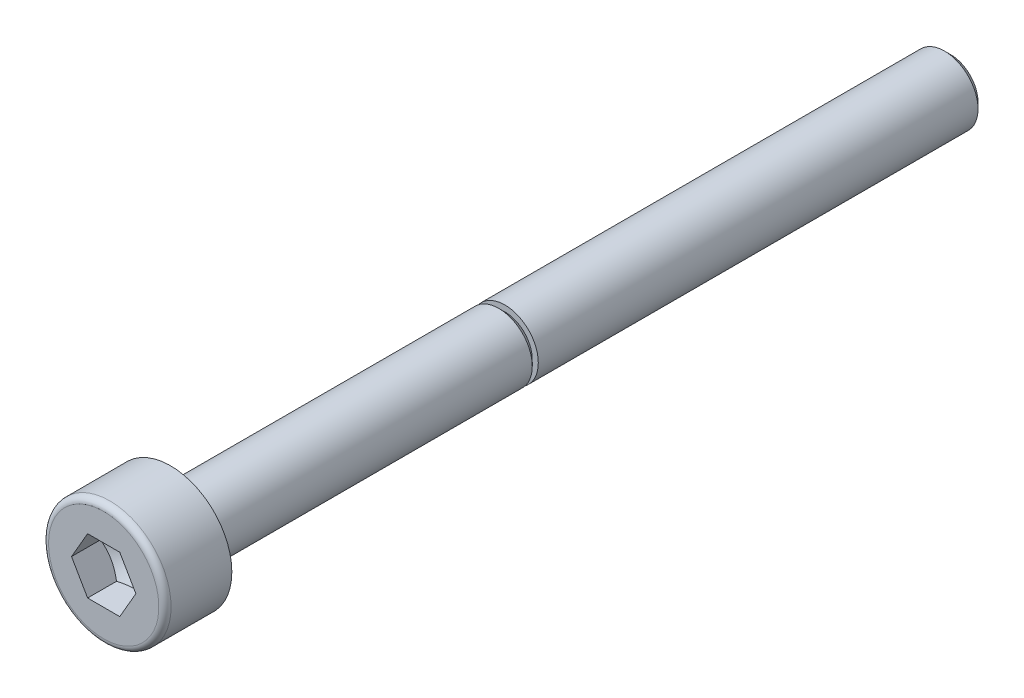
ISO-10303-21;
HEADER;
FILE_DESCRIPTION(('STEP AP214'),'2;1');
FILE_NAME('part.step','',(''),(''),'','','');
FILE_SCHEMA(('AUTOMOTIVE_DESIGN { 1 0 10303 214 1 1 1 1 }'));
ENDSEC;
DATA;
#1=APPLICATION_CONTEXT('core data for automotive mechanical design processes');
#2=APPLICATION_PROTOCOL_DEFINITION('international standard','automotive_design',2000,#1);
#3=PRODUCT_CONTEXT('',#1,'mechanical');
#4=PRODUCT('Part','Part','',(#3));
#5=PRODUCT_RELATED_PRODUCT_CATEGORY('part','',(#4));
#6=PRODUCT_DEFINITION_FORMATION('','',#4);
#7=PRODUCT_DEFINITION_CONTEXT('part definition',#1,'design');
#8=PRODUCT_DEFINITION('design','',#6,#7);
#9=PRODUCT_DEFINITION_SHAPE('','',#8);
#10=(LENGTH_UNIT() NAMED_UNIT(*) SI_UNIT(.MILLI.,.METRE.));
#11=(NAMED_UNIT(*) PLANE_ANGLE_UNIT() SI_UNIT($,.RADIAN.));
#12=(NAMED_UNIT(*) SI_UNIT($,.STERADIAN.) SOLID_ANGLE_UNIT());
#13=UNCERTAINTY_MEASURE_WITH_UNIT(LENGTH_MEASURE(1.E-05),#10,'distance_accuracy_value','');
#14=(GEOMETRIC_REPRESENTATION_CONTEXT(3) GLOBAL_UNCERTAINTY_ASSIGNED_CONTEXT((#13)) GLOBAL_UNIT_ASSIGNED_CONTEXT((#10,
#11,#12)) REPRESENTATION_CONTEXT('',''));
#15=CARTESIAN_POINT('',(0.,0.,0.));
#16=DIRECTION('',(0.,0.,1.));
#17=DIRECTION('',(1.,0.,0.));
#18=AXIS2_PLACEMENT_3D('',#15,#16,#17);
#19=CARTESIAN_POINT('',(0.,0.,-35.));
#20=DIRECTION('',(0.,0.,1.));
#21=DIRECTION('',(1.,0.,0.));
#22=AXIS2_PLACEMENT_3D('',#19,#20,#21);
#23=CYLINDRICAL_SURFACE('',#22,1.5);
#24=CARTESIAN_POINT('',(0.,0.,-34.729375));
#25=DIRECTION('',(0.,0.,1.));
#26=DIRECTION('',(1.,0.,0.));
#27=AXIS2_PLACEMENT_3D('',#24,#25,#26);
#28=CIRCLE('',#27,1.5);
#29=CARTESIAN_POINT('',(1.49999999999999,0.,-34.729375));
#30=VERTEX_POINT('',#29);
#31=EDGE_CURVE('E69',#30,#30,#28,.T.);
#32=ORIENTED_EDGE('',*,*,#31,.T.);
#33=EDGE_LOOP('',(#32));
#34=FACE_BOUND('',#33,.T.);
#35=CARTESIAN_POINT('',(0.,0.,-15.));
#36=DIRECTION('',(0.,0.,1.));
#37=DIRECTION('',(1.,0.,0.));
#38=AXIS2_PLACEMENT_3D('',#35,#36,#37);
#39=CIRCLE('',#38,1.5);
#40=CARTESIAN_POINT('',(1.5,0.,-15.));
#41=VERTEX_POINT('',#40);
#42=EDGE_CURVE('E73',#41,#41,#39,.T.);
#43=ORIENTED_EDGE('',*,*,#42,.F.);
#44=EDGE_LOOP('',(#43));
#45=FACE_BOUND('',#44,.T.);
#46=ADVANCED_FACE('F62',(#34,#45),#23,.T.);
#47=CARTESIAN_POINT('',(0.,0.,-35.));
#48=DIRECTION('',(0.,0.,1.));
#49=DIRECTION('',(1.,0.,0.));
#50=AXIS2_PLACEMENT_3D('',#47,#48,#49);
#51=PLANE('',#50);
#52=CARTESIAN_POINT('',(0.,0.,-35.));
#53=DIRECTION('',(0.,0.,1.));
#54=DIRECTION('',(1.,0.,0.));
#55=AXIS2_PLACEMENT_3D('',#52,#53,#54);
#56=CIRCLE('',#55,1.229375);
#57=CARTESIAN_POINT('',(1.22937499999999,0.,-35.));
#58=VERTEX_POINT('',#57);
#59=EDGE_CURVE('E13',#58,#58,#56,.F.);
#60=ORIENTED_EDGE('',*,*,#59,.T.);
#61=EDGE_LOOP('',(#60));
#62=FACE_BOUND('',#61,.T.);
#63=ADVANCED_FACE('F83',(#62),#51,.F.);
#64=CARTESIAN_POINT('',(0.,0.,-15.));
#65=DIRECTION('',(0.,0.,1.));
#66=DIRECTION('',(1.,0.,0.));
#67=AXIS2_PLACEMENT_3D('',#64,#65,#66);
#68=PLANE('',#67);
#69=ORIENTED_EDGE('',*,*,#42,.T.);
#70=EDGE_LOOP('',(#69));
#71=FACE_BOUND('',#70,.T.);
#72=ADVANCED_FACE('F80',(#71),#68,.T.);
#73=CARTESIAN_POINT('',(0.,0.,-34.729375));
#74=DIRECTION('',(0.,0.,1.));
#75=DIRECTION('',(1.,0.,0.));
#76=AXIS2_PLACEMENT_3D('',#73,#74,#75);
#77=CONICAL_SURFACE('',#76,1.5,0.785398163397468);
#78=ORIENTED_EDGE('',*,*,#59,.F.);
#79=EDGE_LOOP('',(#78));
#80=FACE_BOUND('',#79,.T.);
#81=ORIENTED_EDGE('',*,*,#31,.F.);
#82=EDGE_LOOP('',(#81));
#83=FACE_BOUND('',#82,.T.);
#84=ADVANCED_FACE('F64',(#80,#83),#77,.T.);
#85=CLOSED_SHELL('',(#46,#63,#72,#84));
#86=MANIFOLD_SOLID_BREP('B2',#85);
#87=CARTESIAN_POINT('',(0.,2.475,3.));
#88=DIRECTION('',(0.,0.,-1.));
#89=DIRECTION('',(-1.,0.,0.));
#90=AXIS2_PLACEMENT_3D('',#87,#88,#89);
#91=PLANE('',#90);
#92=CARTESIAN_POINT('',(0.,0.,3.));
#93=DIRECTION('',(0.,0.,-1.));
#94=DIRECTION('',(-1.,0.,0.));
#95=AXIS2_PLACEMENT_3D('',#92,#93,#94);
#96=CIRCLE('',#95,2.475);
#97=CARTESIAN_POINT('',(-2.475,0.,3.));
#98=VERTEX_POINT('',#97);
#99=EDGE_CURVE('E123',#98,#98,#96,.F.);
#100=ORIENTED_EDGE('',*,*,#99,.T.);
#101=EDGE_LOOP('',(#100));
#102=FACE_BOUND('',#101,.T.);
#103=DIRECTION('',(0.5,-0.866025403784439,0.));
#104=VECTOR('',#103,1.);
#105=CARTESIAN_POINT('',(0.721687499999998,1.24999941718737,3.));
#106=LINE('',#105,#104);
#107=CARTESIAN_POINT('',(0.721687499999998,1.24999941718737,3.));
#108=VERTEX_POINT('',#107);
#109=CARTESIAN_POINT('',(1.443375,0.,3.));
#110=VERTEX_POINT('',#109);
#111=EDGE_CURVE('E130',#108,#110,#106,.T.);
#112=ORIENTED_EDGE('',*,*,#111,.T.);
#113=DIRECTION('',(-0.5,-0.866025403784439,0.));
#114=VECTOR('',#113,1.);
#115=CARTESIAN_POINT('',(1.443375,0.,3.));
#116=LINE('',#115,#114);
#117=CARTESIAN_POINT('',(0.721687499999998,-1.24999941718737,3.));
#118=VERTEX_POINT('',#117);
#119=EDGE_CURVE('E228',#110,#118,#116,.T.);
#120=ORIENTED_EDGE('',*,*,#119,.T.);
#121=DIRECTION('',(-1.,0.,0.));
#122=VECTOR('',#121,1.);
#123=CARTESIAN_POINT('',(0.721687499999998,-1.24999941718737,3.));
#124=LINE('',#123,#122);
#125=CARTESIAN_POINT('',(-0.721687499999998,-1.24999941718737,3.));
#126=VERTEX_POINT('',#125);
#127=EDGE_CURVE('E404',#118,#126,#124,.T.);
#128=ORIENTED_EDGE('',*,*,#127,.T.);
#129=DIRECTION('',(-0.5,0.866025403784439,0.));
#130=VECTOR('',#129,1.);
#131=CARTESIAN_POINT('',(-0.721687499999998,-1.24999941718737,3.));
#132=LINE('',#131,#130);
#133=CARTESIAN_POINT('',(-1.443375,0.,3.));
#134=VERTEX_POINT('',#133);
#135=EDGE_CURVE('E395',#126,#134,#132,.T.);
#136=ORIENTED_EDGE('',*,*,#135,.T.);
#137=DIRECTION('',(0.5,0.866025403784439,0.));
#138=VECTOR('',#137,1.);
#139=CARTESIAN_POINT('',(-1.443375,0.,3.));
#140=LINE('',#139,#138);
#141=CARTESIAN_POINT('',(-0.721687499999998,1.24999941718737,3.));
#142=VERTEX_POINT('',#141);
#143=EDGE_CURVE('E202',#134,#142,#140,.T.);
#144=ORIENTED_EDGE('',*,*,#143,.T.);
#145=DIRECTION('',(1.,0.,0.));
#146=VECTOR('',#145,1.);
#147=CARTESIAN_POINT('',(-0.721687499999998,1.24999941718737,3.));
#148=LINE('',#147,#146);
#149=EDGE_CURVE('E194',#142,#108,#148,.T.);
#150=ORIENTED_EDGE('',*,*,#149,.T.);
#151=EDGE_LOOP('',(#112,#120,#128,#136,#144,#150));
#152=FACE_BOUND('',#151,.T.);
#153=ADVANCED_FACE('F115',(#102,#152),#91,.F.);
#154=CARTESIAN_POINT('',(0.,0.,0.));
#155=DIRECTION('',(0.,0.,1.));
#156=DIRECTION('',(1.,0.,0.));
#157=AXIS2_PLACEMENT_3D('',#154,#155,#156);
#158=PLANE('',#157);
#159=CARTESIAN_POINT('',(0.,0.,0.));
#160=DIRECTION('',(0.,0.,1.));
#161=DIRECTION('',(1.,0.,0.));
#162=AXIS2_PLACEMENT_3D('',#159,#160,#161);
#163=CIRCLE('',#162,1.5);
#164=CARTESIAN_POINT('',(1.5,0.,0.));
#165=VERTEX_POINT('',#164);
#166=EDGE_CURVE('E439',#165,#165,#163,.T.);
#167=ORIENTED_EDGE('',*,*,#166,.T.);
#168=EDGE_LOOP('',(#167));
#169=FACE_BOUND('',#168,.T.);
#170=CARTESIAN_POINT('',(0.,0.,0.));
#171=DIRECTION('',(0.,0.,1.));
#172=DIRECTION('',(1.,0.,0.));
#173=AXIS2_PLACEMENT_3D('',#170,#171,#172);
#174=CIRCLE('',#173,2.75);
#175=CARTESIAN_POINT('',(2.75,0.,0.));
#176=VERTEX_POINT('',#175);
#177=EDGE_CURVE('E310',#176,#176,#174,.T.);
#178=ORIENTED_EDGE('',*,*,#177,.F.);
#179=EDGE_LOOP('',(#178));
#180=FACE_BOUND('',#179,.T.);
#181=ADVANCED_FACE('F282',(#169,#180),#158,.F.);
#182=CARTESIAN_POINT('',(0.,0.,3.));
#183=DIRECTION('',(0.,0.,1.));
#184=DIRECTION('',(1.,0.,0.));
#185=AXIS2_PLACEMENT_3D('',#182,#183,#184);
#186=CYLINDRICAL_SURFACE('',#185,2.75);
#187=CARTESIAN_POINT('',(0.,0.,2.72499999999998));
#188=DIRECTION('',(0.,0.,-1.));
#189=DIRECTION('',(-1.,0.,0.));
#190=AXIS2_PLACEMENT_3D('',#187,#188,#189);
#191=CIRCLE('',#190,2.75);
#192=CARTESIAN_POINT('',(-2.75,0.,2.72499999999998));
#193=VERTEX_POINT('',#192);
#194=EDGE_CURVE('E60',#193,#193,#191,.T.);
#195=ORIENTED_EDGE('',*,*,#194,.T.);
#196=EDGE_LOOP('',(#195));
#197=FACE_BOUND('',#196,.T.);
#198=ORIENTED_EDGE('',*,*,#177,.T.);
#199=EDGE_LOOP('',(#198));
#200=FACE_BOUND('',#199,.T.);
#201=ADVANCED_FACE('F280',(#197,#200),#186,.T.);
#202=CARTESIAN_POINT('',(0.721687499999998,1.24999941718737,0.866667055208437));
#203=DIRECTION('',(-0.866025403784439,-0.5,0.));
#204=DIRECTION('',(-0.5,0.866025403784439,0.));
#205=AXIS2_PLACEMENT_3D('',#202,#203,#204);
#206=PLANE('',#205);
#207=DIRECTION('',(0.,0.,1.));
#208=VECTOR('',#207,1.);
#209=CARTESIAN_POINT('',(1.443375,0.,0.866667055208437));
#210=LINE('',#209,#208);
#211=CARTESIAN_POINT('',(1.443375,0.,1.69999999999998));
#212=VERTEX_POINT('',#211);
#213=EDGE_CURVE('E315',#212,#110,#210,.T.);
#214=ORIENTED_EDGE('',*,*,#213,.T.);
#215=ORIENTED_EDGE('',*,*,#111,.F.);
#216=DIRECTION('',(0.,0.,1.));
#217=VECTOR('',#216,1.);
#218=CARTESIAN_POINT('',(0.721687499999998,1.24999941718737,0.866667055208437));
#219=LINE('',#218,#217);
#220=CARTESIAN_POINT('',(0.721687499999998,1.24999941718737,1.69999999999998));
#221=VERTEX_POINT('',#220);
#222=EDGE_CURVE('E187',#221,#108,#219,.T.);
#223=ORIENTED_EDGE('',*,*,#222,.F.);
#224=CARTESIAN_POINT('',(1.44337615470054,-1.99999999894729E-06,1.70000066666748));
#225=CARTESIAN_POINT('',(1.41166234028678,0.0549279378664346,1.68168533615402));
#226=CARTESIAN_POINT('',(1.37967477272109,0.110332030100755,1.66502849324202));
#227=CARTESIAN_POINT('',(1.31514579266581,0.222099502117097,1.63595445502156));
#228=CARTESIAN_POINT('',(1.28260323398259,0.278464867164726,1.62354754391632));
#229=CARTESIAN_POINT('',(1.2179214008177,0.390497088533013,1.60423526604098));
#230=CARTESIAN_POINT('',(1.18579207575664,0.44614671195166,1.59720135081685));
#231=CARTESIAN_POINT('',(1.12138232312734,0.557707676008565,1.58880584887113));
#232=CARTESIAN_POINT('',(1.08910212951503,0.613618611423239,1.58743730832821));
#233=CARTESIAN_POINT('',(1.02878989848834,0.718082459879307,1.59029140151108));
#234=CARTESIAN_POINT('',(1.00074881136366,0.766651047478702,1.59381326069778));
#235=CARTESIAN_POINT('',(0.94484931590916,0.863471813723369,1.60497329524829));
#236=CARTESIAN_POINT('',(0.916991100780736,0.911723657733983,1.61261527923589));
#237=CARTESIAN_POINT('',(0.86097644432145,1.00874388868998,1.63171878575367));
#238=CARTESIAN_POINT('',(0.83282708893236,1.0575000024242,1.64326125012846));
#239=CARTESIAN_POINT('',(0.776948107685497,1.15428523701896,1.66945777436062));
#240=CARTESIAN_POINT('',(0.749217766489108,1.20231559688232,1.6841056829099));
#241=CARTESIAN_POINT('',(0.721686345299462,1.25000141718737,1.70000066666748));
#242=B_SPLINE_CURVE_WITH_KNOTS('',3,(#224,#225,#226,#227,#228,#229,#230,#231,#232,#233,#234,
#235,#236,#237,#238,#239,#240,#241),.UNSPECIFIED.,.F.,.F.,(4,2,2,2,2,2,2,2,4),(0.,
0.198135072963002,0.396746271230007,0.590442442133861,0.783900794935017,0.952318546997794,
1.12089225123218,1.29320414395206,1.46517785562983),.UNSPECIFIED.);
#243=EDGE_CURVE('E179',#212,#221,#242,.T.);
#244=ORIENTED_EDGE('',*,*,#243,.F.);
#245=EDGE_LOOP('',(#214,#215,#223,#244));
#246=FACE_BOUND('',#245,.T.);
#247=ADVANCED_FACE('F188',(#246),#206,.T.);
#248=CARTESIAN_POINT('',(1.443375,0.,0.866667055208437));
#249=DIRECTION('',(-0.866025403784439,0.5,0.));
#250=DIRECTION('',(0.5,0.866025403784439,0.));
#251=AXIS2_PLACEMENT_3D('',#248,#249,#250);
#252=PLANE('',#251);
#253=DIRECTION('',(0.,0.,1.));
#254=VECTOR('',#253,1.);
#255=CARTESIAN_POINT('',(0.721687499999998,-1.24999941718737,0.866667055208437));
#256=LINE('',#255,#254);
#257=CARTESIAN_POINT('',(0.721687499999998,-1.24999941718737,1.69999999999998));
#258=VERTEX_POINT('',#257);
#259=EDGE_CURVE('E380',#258,#118,#256,.T.);
#260=ORIENTED_EDGE('',*,*,#259,.T.);
#261=ORIENTED_EDGE('',*,*,#119,.F.);
#262=ORIENTED_EDGE('',*,*,#213,.F.);
#263=CARTESIAN_POINT('',(0.721686345299462,-1.25000141718737,1.70000066666748));
#264=CARTESIAN_POINT('',(0.753400159713214,-1.19507147932093,1.68168533615402));
#265=CARTESIAN_POINT('',(0.785387727278904,-1.13966738708661,1.66502849324202));
#266=CARTESIAN_POINT('',(0.849916707334183,-1.02789991507027,1.63595445502156));
#267=CARTESIAN_POINT('',(0.882459266017403,-0.971534550022641,1.62354754391632));
#268=CARTESIAN_POINT('',(0.947141099182295,-0.859502328654354,1.60423526604098));
#269=CARTESIAN_POINT('',(0.979270424243352,-0.803852705235706,1.59720135081685));
#270=CARTESIAN_POINT('',(1.04368017687266,-0.692291741178803,1.58880584887113));
#271=CARTESIAN_POINT('',(1.07596037048497,-0.636380805764131,1.58743730832821));
#272=CARTESIAN_POINT('',(1.13627260151167,-0.531916957308063,1.59029140151108));
#273=CARTESIAN_POINT('',(1.16431368863633,-0.483348369708665,1.59381326069778));
#274=CARTESIAN_POINT('',(1.22021318409084,-0.386527603463997,1.60497329524829));
#275=CARTESIAN_POINT('',(1.24807139921926,-0.338275759453383,1.61261527923589));
#276=CARTESIAN_POINT('',(1.30408605567855,-0.241255528497384,1.63171878575367));
#277=CARTESIAN_POINT('',(1.33223541106764,-0.192499414763167,1.64326125012846));
#278=CARTESIAN_POINT('',(1.3881143923145,-0.0957141801684109,1.66945777436061));
#279=CARTESIAN_POINT('',(1.41584473351089,-0.0476838203050453,1.6841056829099));
#280=CARTESIAN_POINT('',(1.44337615470054,1.99999999894729E-06,1.70000066666748));
#281=B_SPLINE_CURVE_WITH_KNOTS('',3,(#263,#264,#265,#266,#267,#268,#269,#270,#271,#272,#273,
#274,#275,#276,#277,#278,#279,#280),.UNSPECIFIED.,.F.,.F.,(4,2,2,2,2,2,2,2,4),(0.,
0.198135072963002,0.396746271230008,0.590442442133861,0.783900794935017,0.952318546997795,
1.12089225123218,1.29320414395206,1.46517785562983),.UNSPECIFIED.);
#282=EDGE_CURVE('E183',#258,#212,#281,.T.);
#283=ORIENTED_EDGE('',*,*,#282,.F.);
#284=EDGE_LOOP('',(#260,#261,#262,#283));
#285=FACE_BOUND('',#284,.T.);
#286=ADVANCED_FACE('F271',(#285),#252,.T.);
#287=CARTESIAN_POINT('',(0.721687499999998,-1.24999941718737,0.866667055208437));
#288=DIRECTION('',(0.,1.,0.));
#289=DIRECTION('',(1.,0.,0.));
#290=AXIS2_PLACEMENT_3D('',#287,#288,#289);
#291=PLANE('',#290);
#292=DIRECTION('',(0.,0.,1.));
#293=VECTOR('',#292,1.);
#294=CARTESIAN_POINT('',(-0.721687499999998,-1.24999941718737,0.866667055208437));
#295=LINE('',#294,#293);
#296=CARTESIAN_POINT('',(-0.721687499999998,-1.24999941718737,1.69999999999998));
#297=VERTEX_POINT('',#296);
#298=EDGE_CURVE('E383',#297,#126,#295,.T.);
#299=ORIENTED_EDGE('',*,*,#298,.T.);
#300=ORIENTED_EDGE('',*,*,#127,.F.);
#301=ORIENTED_EDGE('',*,*,#259,.F.);
#302=CARTESIAN_POINT('',(-1.8689305310749,-1.24999941718737,2.16479389453661));
#303=CARTESIAN_POINT('',(-1.81495117776836,-1.24999941718737,2.13889663446086));
#304=CARTESIAN_POINT('',(-1.76084043441986,-1.24999941718737,2.11326843017584));
#305=CARTESIAN_POINT('',(-1.65228585942288,-1.24999941718737,2.06270259301795));
#306=CARTESIAN_POINT('',(-1.59784196995445,-1.24999941718737,2.0377650844244));
#307=CARTESIAN_POINT('',(-1.48823862830604,-1.24999941718737,1.98859378412849));
#308=CARTESIAN_POINT('',(-1.43307683885742,-1.24999941718737,1.96436517881802));
#309=CARTESIAN_POINT('',(-1.32229127521218,-1.24999941718737,1.91699497239769));
#310=CARTESIAN_POINT('',(-1.26666752521414,-1.24999941718737,1.89385331476834));
#311=CARTESIAN_POINT('',(-1.15340030068292,-1.24999941718737,1.84835454701776));
#312=CARTESIAN_POINT('',(-1.09574203904476,-1.24999941718737,1.82603375946841));
#313=CARTESIAN_POINT('',(-0.979740631963512,-1.24999941718737,1.78325544018152));
#314=CARTESIAN_POINT('',(-0.921397401730971,-1.24999941718737,1.7627981419224));
#315=CARTESIAN_POINT('',(-0.745435180245363,-1.24999941718737,1.70508423616541));
#316=CARTESIAN_POINT('',(-0.626561647576071,-1.24999941718737,1.6713502286798));
#317=CARTESIAN_POINT('',(-0.445872875814715,-1.24999941718737,1.63222043843359));
#318=CARTESIAN_POINT('',(-0.385304520505473,-1.24999941718737,1.6210940974006));
#319=CARTESIAN_POINT('',(-0.263486469039547,-1.24999941718737,1.60342789727155));
#320=CARTESIAN_POINT('',(-0.202236819210178,-1.24999941718737,1.59688772823407));
#321=CARTESIAN_POINT('',(-0.0801324091719253,-1.24999941718737,1.58899883278389));
#322=CARTESIAN_POINT('',(-0.0192817104364652,-1.24999941718737,1.58758884366633));
#323=CARTESIAN_POINT('',(0.102319185361569,-1.24999941718737,1.58991623923037));
#324=CARTESIAN_POINT('',(0.163069375967905,-1.24999941718737,1.59365394263641));
#325=CARTESIAN_POINT('',(0.312961455362284,-1.24999941718737,1.60889807076612));
#326=CARTESIAN_POINT('',(0.401812872634314,-1.24999941718737,1.62326128492052));
#327=CARTESIAN_POINT('',(0.577787885436377,-1.24999941718737,1.66029986996747));
#328=CARTESIAN_POINT('',(0.664909264565288,-1.24999941718737,1.68298525900321));
#329=CARTESIAN_POINT('',(0.795208864990645,-1.24999941718737,1.7217374465809));
#330=CARTESIAN_POINT('',(0.839060620655925,-1.24999941718737,1.73562293145018));
#331=CARTESIAN_POINT('',(0.926307663712629,-1.24999941718737,1.76467838801276));
#332=CARTESIAN_POINT('',(0.969703217226746,-1.24999941718737,1.77984755808706));
#333=CARTESIAN_POINT('',(1.05609584795377,-1.24999941718737,1.81125008410186));
#334=CARTESIAN_POINT('',(1.09909299597127,-1.24999941718737,1.82748324664254));
#335=CARTESIAN_POINT('',(1.18474848915207,-1.24999941718737,1.86083816989019));
#336=CARTESIAN_POINT('',(1.22740677566046,-1.24999941718737,1.87796008072948));
#337=CARTESIAN_POINT('',(1.33629337906013,-1.24999941718737,1.92276108125509));
#338=CARTESIAN_POINT('',(1.40230397627436,-1.24999941718737,1.95096876212353));
#339=CARTESIAN_POINT('',(1.5337290746305,-1.24999941718737,2.0087438912197));
#340=CARTESIAN_POINT('',(1.59914353067596,-1.24999941718737,2.03831144131145));
#341=CARTESIAN_POINT('',(1.79469131828895,-1.24999941718737,2.12857452862347));
#342=CARTESIAN_POINT('',(1.92410722703436,-1.24999941718737,2.19082124932176));
#343=CARTESIAN_POINT('',(2.18183340208153,-1.24999941718737,2.31792530727725));
#344=CARTESIAN_POINT('',(2.31014211360568,-1.24999941718737,2.38278575976991));
#345=CARTESIAN_POINT('',(2.56588043764099,-1.24999941718737,2.51417443954415));
#346=CARTESIAN_POINT('',(2.69331015929243,-1.24999941718737,2.58070245483919));
#347=CARTESIAN_POINT('',(2.93556233058971,-1.24999941718737,2.70857379582092));
#348=CARTESIAN_POINT('',(3.05043950275985,-1.24999941718737,2.7698138094335));
#349=CARTESIAN_POINT('',(3.27982431975771,-1.24999941718737,2.89299160700424));
#350=CARTESIAN_POINT('',(3.39433195070738,-1.24999941718737,2.95492941678458));
#351=CARTESIAN_POINT('',(3.62277162051501,-1.24999941718737,3.07916961449807));
#352=CARTESIAN_POINT('',(3.73670438259661,-1.24999941718737,3.14147067442079));
#353=CARTESIAN_POINT('',(3.96433956104114,-1.24999941718737,3.26647828608533));
#354=CARTESIAN_POINT('',(4.07804198914646,-1.24999941718736,3.32918481643642));
#355=CARTESIAN_POINT('',(4.19166166337243,-1.24999941718736,3.39204003381011));
#356=B_SPLINE_CURVE_WITH_KNOTS('',3,(#302,#303,#304,#305,#306,#307,#308,#309,#310,#311,#312,
#313,#314,#315,#316,#317,#318,#319,#320,#321,#322,#323,#324,#325,#326,#327,#328,#329,#330,#331,
#332,#333,#334,#335,#336,#337,#338,#339,#340,#341,#342,#343,#344,#345,#346,#347,#348,#349,#350,
#351,#352,#353,#354,#355),.UNSPECIFIED.,.F.,.F.,(4,2,2,2,2,2,2,2,2,2,2,2,2,2,2,2,2,2,2,2,2,2,2,
2,2,2,4),(0.,0.179612840817482,0.359257792773133,0.53999247739352,0.720717753677288,
0.906167353114827,1.09164015584897,1.46153946542598,1.64614477745769,1.83073761234132,
2.01311873652213,2.1955111535168,2.46497183475508,2.73475795996104,2.87273569413165,
3.01062789275233,3.14849509611697,3.28638566505406,3.50171816734965,3.71706682595867,
4.14783526963881,4.57913326931209,5.01037671616213,5.40091711572384,5.7914720151541,
6.18103353481211,6.57057466801424),.UNSPECIFIED.);
#357=EDGE_CURVE('E261',#297,#258,#356,.T.);
#358=ORIENTED_EDGE('',*,*,#357,.F.);
#359=EDGE_LOOP('',(#299,#300,#301,#358));
#360=FACE_BOUND('',#359,.T.);
#361=ADVANCED_FACE('F267',(#360),#291,.T.);
#362=CARTESIAN_POINT('',(-0.721687499999998,-1.24999941718737,0.866667055208437));
#363=DIRECTION('',(0.866025403784439,0.5,0.));
#364=DIRECTION('',(0.5,-0.866025403784439,0.));
#365=AXIS2_PLACEMENT_3D('',#362,#363,#364);
#366=PLANE('',#365);
#367=DIRECTION('',(0.,0.,1.));
#368=VECTOR('',#367,1.);
#369=CARTESIAN_POINT('',(-1.443375,0.,0.866667055208437));
#370=LINE('',#369,#368);
#371=CARTESIAN_POINT('',(-1.443375,0.,1.69999999999998));
#372=VERTEX_POINT('',#371);
#373=EDGE_CURVE('E200',#372,#134,#370,.T.);
#374=ORIENTED_EDGE('',*,*,#373,.T.);
#375=ORIENTED_EDGE('',*,*,#135,.F.);
#376=ORIENTED_EDGE('',*,*,#298,.F.);
#377=CARTESIAN_POINT('',(-1.44337615470054,1.99999999894729E-06,1.70000066666748));
#378=CARTESIAN_POINT('',(-1.41166234028678,-0.0549279378664346,1.68168533615402));
#379=CARTESIAN_POINT('',(-1.37967477272109,-0.110332030100755,1.66502849324202));
#380=CARTESIAN_POINT('',(-1.31514579266581,-0.222099502117098,1.63595445502156));
#381=CARTESIAN_POINT('',(-1.28260323398259,-0.278464867164726,1.62354754391632));
#382=CARTESIAN_POINT('',(-1.2179214008177,-0.390497088533013,1.60423526604098));
#383=CARTESIAN_POINT('',(-1.18579207575664,-0.44614671195166,1.59720135081685));
#384=CARTESIAN_POINT('',(-1.12138232312734,-0.557707676008565,1.58880584887113));
#385=CARTESIAN_POINT('',(-1.08910212951503,-0.613618611423239,1.58743730832821));
#386=CARTESIAN_POINT('',(-1.02878989848834,-0.718082459879307,1.59029140151108));
#387=CARTESIAN_POINT('',(-1.00074881136366,-0.766651047478702,1.59381326069778));
#388=CARTESIAN_POINT('',(-0.94484931590916,-0.863471813723369,1.60497329524829));
#389=CARTESIAN_POINT('',(-0.916991100780736,-0.911723657733983,1.61261527923589));
#390=CARTESIAN_POINT('',(-0.86097644432145,-1.00874388868998,1.63171878575367));
#391=CARTESIAN_POINT('',(-0.83282708893236,-1.0575000024242,1.64326125012846));
#392=CARTESIAN_POINT('',(-0.776948107685497,-1.15428523701896,1.66945777436062));
#393=CARTESIAN_POINT('',(-0.749217766489108,-1.20231559688232,1.6841056829099));
#394=CARTESIAN_POINT('',(-0.721686345299462,-1.25000141718737,1.70000066666748));
#395=B_SPLINE_CURVE_WITH_KNOTS('',3,(#377,#378,#379,#380,#381,#382,#383,#384,#385,#386,#387,
#388,#389,#390,#391,#392,#393,#394),.UNSPECIFIED.,.F.,.F.,(4,2,2,2,2,2,2,2,4),(0.,
0.198135072963002,0.396746271230008,0.590442442133861,0.783900794935017,0.952318546997794,
1.12089225123218,1.29320414395206,1.46517785562983),.UNSPECIFIED.);
#396=EDGE_CURVE('E256',#372,#297,#395,.T.);
#397=ORIENTED_EDGE('',*,*,#396,.F.);
#398=EDGE_LOOP('',(#374,#375,#376,#397));
#399=FACE_BOUND('',#398,.T.);
#400=ADVANCED_FACE('F270',(#399),#366,.T.);
#401=CARTESIAN_POINT('',(-1.443375,0.,0.866667055208437));
#402=DIRECTION('',(0.866025403784439,-0.5,0.));
#403=DIRECTION('',(-0.5,-0.866025403784439,0.));
#404=AXIS2_PLACEMENT_3D('',#401,#402,#403);
#405=PLANE('',#404);
#406=DIRECTION('',(0.,0.,1.));
#407=VECTOR('',#406,1.);
#408=CARTESIAN_POINT('',(-0.721687499999998,1.24999941718737,0.866667055208437));
#409=LINE('',#408,#407);
#410=CARTESIAN_POINT('',(-0.721687499999998,1.24999941718737,1.69999999999998));
#411=VERTEX_POINT('',#410);
#412=EDGE_CURVE('E193',#411,#142,#409,.T.);
#413=ORIENTED_EDGE('',*,*,#412,.T.);
#414=ORIENTED_EDGE('',*,*,#143,.F.);
#415=ORIENTED_EDGE('',*,*,#373,.F.);
#416=CARTESIAN_POINT('',(-0.721686345299462,1.25000141718737,1.70000066666748));
#417=CARTESIAN_POINT('',(-0.753400159713214,1.19507147932093,1.68168533615402));
#418=CARTESIAN_POINT('',(-0.785387727278904,1.13966738708661,1.66502849324202));
#419=CARTESIAN_POINT('',(-0.849916707334183,1.02789991507027,1.63595445502156));
#420=CARTESIAN_POINT('',(-0.882459266017403,0.971534550022641,1.62354754391632));
#421=CARTESIAN_POINT('',(-0.947141099182295,0.859502328654354,1.60423526604098));
#422=CARTESIAN_POINT('',(-0.979270424243352,0.803852705235706,1.59720135081685));
#423=CARTESIAN_POINT('',(-1.04368017687266,0.692291741178803,1.58880584887113));
#424=CARTESIAN_POINT('',(-1.07596037048497,0.636380805764131,1.58743730832821));
#425=CARTESIAN_POINT('',(-1.13627260151167,0.531916957308063,1.59029140151108));
#426=CARTESIAN_POINT('',(-1.16431368863633,0.483348369708664,1.59381326069778));
#427=CARTESIAN_POINT('',(-1.22021318409084,0.386527603463997,1.60497329524829));
#428=CARTESIAN_POINT('',(-1.24807139921926,0.338275759453383,1.61261527923589));
#429=CARTESIAN_POINT('',(-1.30408605567855,0.241255528497384,1.63171878575367));
#430=CARTESIAN_POINT('',(-1.33223541106764,0.192499414763167,1.64326125012846));
#431=CARTESIAN_POINT('',(-1.3881143923145,0.0957141801684109,1.66945777436062));
#432=CARTESIAN_POINT('',(-1.41584473351089,0.0476838203050453,1.6841056829099));
#433=CARTESIAN_POINT('',(-1.44337615470054,-1.99999999894729E-06,1.70000066666748));
#434=B_SPLINE_CURVE_WITH_KNOTS('',3,(#416,#417,#418,#419,#420,#421,#422,#423,#424,#425,#426,
#427,#428,#429,#430,#431,#432,#433),.UNSPECIFIED.,.F.,.F.,(4,2,2,2,2,2,2,2,4),(0.,
0.198135072963002,0.396746271230008,0.590442442133861,0.783900794935017,0.952318546997795,
1.12089225123218,1.29320414395206,1.46517785562983),.UNSPECIFIED.);
#435=EDGE_CURVE('E138',#411,#372,#434,.T.);
#436=ORIENTED_EDGE('',*,*,#435,.F.);
#437=EDGE_LOOP('',(#413,#414,#415,#436));
#438=FACE_BOUND('',#437,.T.);
#439=ADVANCED_FACE('F399',(#438),#405,.T.);
#440=CARTESIAN_POINT('',(-0.721687499999998,1.24999941718737,0.866667055208437));
#441=DIRECTION('',(0.,-1.,0.));
#442=DIRECTION('',(-1.,0.,0.));
#443=AXIS2_PLACEMENT_3D('',#440,#441,#442);
#444=PLANE('',#443);
#445=ORIENTED_EDGE('',*,*,#222,.T.);
#446=ORIENTED_EDGE('',*,*,#149,.F.);
#447=ORIENTED_EDGE('',*,*,#412,.F.);
#448=CARTESIAN_POINT('',(-1.8689305310749,1.24999941718736,2.16479389453661));
#449=CARTESIAN_POINT('',(-1.81495117776836,1.24999941718736,2.13889663446086));
#450=CARTESIAN_POINT('',(-1.76084043441986,1.24999941718737,2.11326843017584));
#451=CARTESIAN_POINT('',(-1.65228585942288,1.24999941718737,2.06270259301795));
#452=CARTESIAN_POINT('',(-1.59784196995445,1.24999941718737,2.0377650844244));
#453=CARTESIAN_POINT('',(-1.48823862830604,1.24999941718737,1.98859378412849));
#454=CARTESIAN_POINT('',(-1.43307683885742,1.24999941718737,1.96436517881802));
#455=CARTESIAN_POINT('',(-1.32229127521218,1.24999941718737,1.91699497239769));
#456=CARTESIAN_POINT('',(-1.26666752521414,1.24999941718737,1.89385331476834));
#457=CARTESIAN_POINT('',(-1.15340030068292,1.24999941718737,1.84835454701776));
#458=CARTESIAN_POINT('',(-1.09574203904476,1.24999941718737,1.82603375946841));
#459=CARTESIAN_POINT('',(-0.979740631963512,1.24999941718737,1.78325544018152));
#460=CARTESIAN_POINT('',(-0.921397401730971,1.24999941718737,1.7627981419224));
#461=CARTESIAN_POINT('',(-0.745435180245364,1.24999941718737,1.70508423616541));
#462=CARTESIAN_POINT('',(-0.626561647576071,1.24999941718737,1.6713502286798));
#463=CARTESIAN_POINT('',(-0.445872875814715,1.24999941718737,1.63222043843359));
#464=CARTESIAN_POINT('',(-0.385304520505473,1.24999941718737,1.6210940974006));
#465=CARTESIAN_POINT('',(-0.263486469039547,1.24999941718737,1.60342789727154));
#466=CARTESIAN_POINT('',(-0.202236819210178,1.24999941718737,1.59688772823407));
#467=CARTESIAN_POINT('',(-0.0801324091719253,1.24999941718737,1.5889988327839));
#468=CARTESIAN_POINT('',(-0.0192817104364652,1.24999941718737,1.58758884366633));
#469=CARTESIAN_POINT('',(0.102319185361569,1.24999941718737,1.58991623923037));
#470=CARTESIAN_POINT('',(0.163069375967905,1.24999941718737,1.59365394263641));
#471=CARTESIAN_POINT('',(0.312961455362284,1.24999941718737,1.60889807076612));
#472=CARTESIAN_POINT('',(0.401812872634314,1.24999941718737,1.62326128492052));
#473=CARTESIAN_POINT('',(0.577787885436377,1.24999941718737,1.66029986996748));
#474=CARTESIAN_POINT('',(0.664909264565288,1.24999941718737,1.68298525900321));
#475=CARTESIAN_POINT('',(0.795208864990645,1.24999941718737,1.7217374465809));
#476=CARTESIAN_POINT('',(0.839060620655925,1.24999941718737,1.73562293145019));
#477=CARTESIAN_POINT('',(0.926307663712629,1.24999941718737,1.76467838801276));
#478=CARTESIAN_POINT('',(0.969703217226746,1.24999941718737,1.77984755808706));
#479=CARTESIAN_POINT('',(1.05609584795377,1.24999941718737,1.81125008410186));
#480=CARTESIAN_POINT('',(1.09909299597127,1.24999941718737,1.82748324664254));
#481=CARTESIAN_POINT('',(1.18474848915207,1.24999941718737,1.86083816989019));
#482=CARTESIAN_POINT('',(1.22740677566046,1.24999941718737,1.87796008072948));
#483=CARTESIAN_POINT('',(1.33629337906013,1.24999941718737,1.92276108125509));
#484=CARTESIAN_POINT('',(1.40230397627436,1.24999941718737,1.95096876212353));
#485=CARTESIAN_POINT('',(1.5337290746305,1.24999941718737,2.0087438912197));
#486=CARTESIAN_POINT('',(1.59914353067596,1.24999941718737,2.03831144131145));
#487=CARTESIAN_POINT('',(1.79469131828895,1.24999941718737,2.12857452862347));
#488=CARTESIAN_POINT('',(1.92410722703436,1.24999941718737,2.19082124932176));
#489=CARTESIAN_POINT('',(2.18183340208153,1.24999941718737,2.31792530727725));
#490=CARTESIAN_POINT('',(2.31014211360568,1.24999941718737,2.38278575976991));
#491=CARTESIAN_POINT('',(2.56588043764099,1.24999941718737,2.51417443954415));
#492=CARTESIAN_POINT('',(2.69331015929243,1.24999941718737,2.58070245483919));
#493=CARTESIAN_POINT('',(2.93556233058971,1.24999941718737,2.70857379582092));
#494=CARTESIAN_POINT('',(3.05043950275985,1.24999941718737,2.7698138094335));
#495=CARTESIAN_POINT('',(3.27982431975771,1.24999941718737,2.89299160700424));
#496=CARTESIAN_POINT('',(3.39433195070738,1.24999941718737,2.95492941678458));
#497=CARTESIAN_POINT('',(3.62277162051501,1.24999941718737,3.07916961449807));
#498=CARTESIAN_POINT('',(3.73670438259661,1.24999941718737,3.14147067442079));
#499=CARTESIAN_POINT('',(3.96433956104114,1.24999941718737,3.26647828608533));
#500=CARTESIAN_POINT('',(4.07804198914646,1.24999941718737,3.32918481643642));
#501=CARTESIAN_POINT('',(4.19166166337243,1.24999941718737,3.39204003381011));
#502=B_SPLINE_CURVE_WITH_KNOTS('',3,(#448,#449,#450,#451,#452,#453,#454,#455,#456,#457,#458,
#459,#460,#461,#462,#463,#464,#465,#466,#467,#468,#469,#470,#471,#472,#473,#474,#475,#476,#477,
#478,#479,#480,#481,#482,#483,#484,#485,#486,#487,#488,#489,#490,#491,#492,#493,#494,#495,#496,
#497,#498,#499,#500,#501),.UNSPECIFIED.,.F.,.F.,(4,2,2,2,2,2,2,2,2,2,2,2,2,2,2,2,2,2,2,2,2,2,2,
2,2,2,4),(0.,0.179612840817482,0.359257792773134,0.53999247739352,0.720717753677288,
0.906167353114827,1.09164015584897,1.46153946542598,1.64614477745769,1.83073761234132,
2.01311873652213,2.1955111535168,2.46497183475508,2.73475795996104,2.87273569413165,
3.01062789275233,3.14849509611697,3.28638566505406,3.50171816734965,3.71706682595867,
4.14783526963881,4.57913326931209,5.01037671616213,5.40091711572384,5.7914720151541,
6.18103353481211,6.57057466801424),.UNSPECIFIED.);
#503=EDGE_CURVE('E180',#221,#411,#502,.F.);
#504=ORIENTED_EDGE('',*,*,#503,.F.);
#505=EDGE_LOOP('',(#445,#446,#447,#504));
#506=FACE_BOUND('',#505,.T.);
#507=ADVANCED_FACE('F175',(#506),#444,.T.);
#508=CARTESIAN_POINT('',(0.,0.,0.866667055208437));
#509=DIRECTION('',(0.,0.,1.));
#510=DIRECTION('',(1.,0.,0.));
#511=AXIS2_PLACEMENT_3D('',#508,#509,#510);
#512=CONICAL_SURFACE('',#511,0.,1.0471975511966);
#513=CARTESIAN_POINT('',(0.,0.,0.866667055208437));
#514=VERTEX_POINT('',#513);
#515=VERTEX_LOOP('',#514);
#516=FACE_BOUND('',#515,.T.);
#517=ORIENTED_EDGE('',*,*,#243,.T.);
#518=ORIENTED_EDGE('',*,*,#503,.T.);
#519=ORIENTED_EDGE('',*,*,#435,.T.);
#520=ORIENTED_EDGE('',*,*,#396,.T.);
#521=ORIENTED_EDGE('',*,*,#357,.T.);
#522=ORIENTED_EDGE('',*,*,#282,.T.);
#523=EDGE_LOOP('',(#517,#518,#519,#520,#521,#522));
#524=FACE_BOUND('',#523,.T.);
#525=ADVANCED_FACE('F171',(#516,#524),#512,.F.);
#526=CARTESIAN_POINT('',(0.,0.,-15.));
#527=DIRECTION('',(0.,0.,1.));
#528=DIRECTION('',(1.,0.,0.));
#529=AXIS2_PLACEMENT_3D('',#526,#527,#528);
#530=CYLINDRICAL_SURFACE('',#529,1.5);
#531=CARTESIAN_POINT('',(0.,0.,-14.729375));
#532=DIRECTION('',(0.,0.,-1.));
#533=DIRECTION('',(-1.,0.,0.));
#534=AXIS2_PLACEMENT_3D('',#531,#532,#533);
#535=CIRCLE('',#534,1.5);
#536=CARTESIAN_POINT('',(-1.5,0.,-14.729375));
#537=VERTEX_POINT('',#536);
#538=EDGE_CURVE('E308',#537,#537,#535,.F.);
#539=ORIENTED_EDGE('',*,*,#538,.T.);
#540=EDGE_LOOP('',(#539));
#541=FACE_BOUND('',#540,.T.);
#542=ORIENTED_EDGE('',*,*,#166,.F.);
#543=EDGE_LOOP('',(#542));
#544=FACE_BOUND('',#543,.T.);
#545=ADVANCED_FACE('F174',(#541,#544),#530,.T.);
#546=CARTESIAN_POINT('',(1.49999999999999,0.,-15.));
#547=DIRECTION('',(0.,0.,-1.));
#548=DIRECTION('',(-1.,0.,0.));
#549=AXIS2_PLACEMENT_3D('',#546,#547,#548);
#550=PLANE('',#549);
#551=CARTESIAN_POINT('',(0.,0.,-15.));
#552=DIRECTION('',(0.,0.,-1.));
#553=DIRECTION('',(-1.,0.,0.));
#554=AXIS2_PLACEMENT_3D('',#551,#552,#553);
#555=CIRCLE('',#554,1.22937499999999);
#556=CARTESIAN_POINT('',(-1.22937499999999,0.,-15.));
#557=VERTEX_POINT('',#556);
#558=EDGE_CURVE('E305',#557,#557,#555,.T.);
#559=ORIENTED_EDGE('',*,*,#558,.T.);
#560=EDGE_LOOP('',(#559));
#561=FACE_BOUND('',#560,.T.);
#562=ADVANCED_FACE('F294',(#561),#550,.T.);
#563=CARTESIAN_POINT('',(0.,0.,-14.729375));
#564=DIRECTION('',(0.,0.,1.));
#565=DIRECTION('',(1.,0.,0.));
#566=AXIS2_PLACEMENT_3D('',#563,#564,#565);
#567=CONICAL_SURFACE('',#566,1.5,0.785398163397457);
#568=ORIENTED_EDGE('',*,*,#558,.F.);
#569=EDGE_LOOP('',(#568));
#570=FACE_BOUND('',#569,.T.);
#571=ORIENTED_EDGE('',*,*,#538,.F.);
#572=EDGE_LOOP('',(#571));
#573=FACE_BOUND('',#572,.T.);
#574=ADVANCED_FACE('F292',(#570,#573),#567,.T.);
#575=CARTESIAN_POINT('',(0.,0.,2.72499999999998));
#576=DIRECTION('',(0.,0.,-1.));
#577=DIRECTION('',(-1.,0.,0.));
#578=AXIS2_PLACEMENT_3D('',#575,#576,#577);
#579=TOROIDAL_SURFACE('',#578,2.475,0.275);
#580=ORIENTED_EDGE('',*,*,#194,.F.);
#581=EDGE_LOOP('',(#580));
#582=FACE_BOUND('',#581,.T.);
#583=ORIENTED_EDGE('',*,*,#99,.F.);
#584=EDGE_LOOP('',(#583));
#585=FACE_BOUND('',#584,.T.);
#586=ADVANCED_FACE('F117',(#582,#585),#579,.T.);
#587=CLOSED_SHELL('',(#153,#181,#201,#247,#286,#361,#400,#439,#507,#525,#545,#562,#574,#586));
#588=MANIFOLD_SOLID_BREP('B8',#587);
#589=ADVANCED_BREP_SHAPE_REPRESENTATION('',(#18,#86,#588),#14);
#590=SHAPE_DEFINITION_REPRESENTATION(#9,#589);
ENDSEC;
END-ISO-10303-21;
